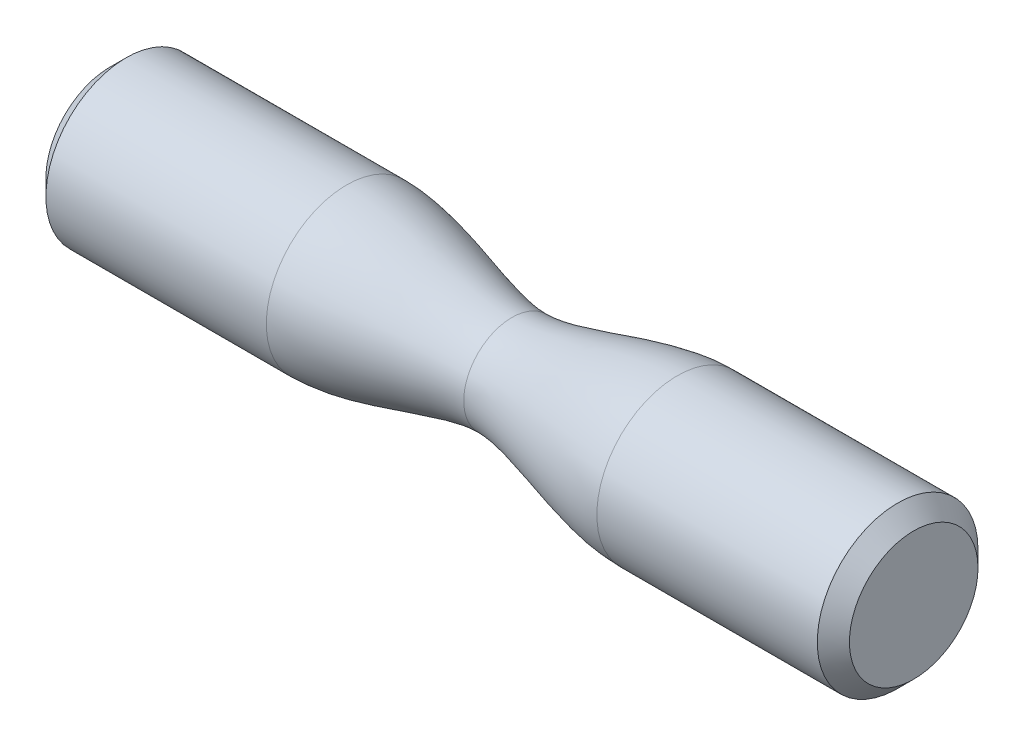
ISO-10303-21;
HEADER;
FILE_DESCRIPTION(('STEP AP214'),'2;1');
FILE_NAME('part.step','',(''),(''),'','','');
FILE_SCHEMA(('AUTOMOTIVE_DESIGN { 1 0 10303 214 1 1 1 1 }'));
ENDSEC;
DATA;
#1=APPLICATION_CONTEXT('core data for automotive mechanical design processes');
#2=APPLICATION_PROTOCOL_DEFINITION('international standard','automotive_design',2000,#1);
#3=PRODUCT_CONTEXT('',#1,'mechanical');
#4=PRODUCT('Part','Part','',(#3));
#5=PRODUCT_RELATED_PRODUCT_CATEGORY('part','',(#4));
#6=PRODUCT_DEFINITION_FORMATION('','',#4);
#7=PRODUCT_DEFINITION_CONTEXT('part definition',#1,'design');
#8=PRODUCT_DEFINITION('design','',#6,#7);
#9=PRODUCT_DEFINITION_SHAPE('','',#8);
#10=(LENGTH_UNIT() NAMED_UNIT(*) SI_UNIT(.MILLI.,.METRE.));
#11=(NAMED_UNIT(*) PLANE_ANGLE_UNIT() SI_UNIT($,.RADIAN.));
#12=(NAMED_UNIT(*) SI_UNIT($,.STERADIAN.) SOLID_ANGLE_UNIT());
#13=UNCERTAINTY_MEASURE_WITH_UNIT(LENGTH_MEASURE(1.E-05),#10,'distance_accuracy_value','');
#14=(GEOMETRIC_REPRESENTATION_CONTEXT(3) GLOBAL_UNCERTAINTY_ASSIGNED_CONTEXT((#13)) GLOBAL_UNIT_ASSIGNED_CONTEXT((#10,
#11,#12)) REPRESENTATION_CONTEXT('',''));
#15=CARTESIAN_POINT('',(0.,0.,0.));
#16=DIRECTION('',(0.,0.,1.));
#17=DIRECTION('',(1.,0.,0.));
#18=AXIS2_PLACEMENT_3D('',#15,#16,#17);
#19=CARTESIAN_POINT('',(-7.9375,0.,0.));
#20=DIRECTION('',(1.,0.,0.));
#21=DIRECTION('',(0.,0.,-1.));
#22=AXIS2_PLACEMENT_3D('',#19,#20,#21);
#23=CYLINDRICAL_SURFACE('',#22,1.5875);
#24=CARTESIAN_POINT('',(-3.26508905624972,0.,0.));
#25=DIRECTION('',(1.,0.,0.));
#26=DIRECTION('',(0.,0.,-1.));
#27=AXIS2_PLACEMENT_3D('',#24,#25,#26);
#28=CIRCLE('',#27,1.58750000000001);
#29=CARTESIAN_POINT('',(-3.26508905624972,0.,-1.58750000000001));
#30=VERTEX_POINT('',#29);
#31=EDGE_CURVE('E50',#30,#30,#28,.T.);
#32=ORIENTED_EDGE('',*,*,#31,.F.);
#33=EDGE_LOOP('',(#32));
#34=FACE_BOUND('',#33,.T.);
#35=CARTESIAN_POINT('',(-7.62,0.,0.));
#36=DIRECTION('',(1.,0.,0.));
#37=DIRECTION('',(0.,0.,-1.));
#38=AXIS2_PLACEMENT_3D('',#35,#36,#37);
#39=CIRCLE('',#38,1.5875);
#40=CARTESIAN_POINT('',(-7.62,0.,-1.5875));
#41=VERTEX_POINT('',#40);
#42=EDGE_CURVE('E41',#41,#41,#39,.T.);
#43=ORIENTED_EDGE('',*,*,#42,.T.);
#44=EDGE_LOOP('',(#43));
#45=FACE_BOUND('',#44,.T.);
#46=ADVANCED_FACE('F30',(#34,#45),#23,.T.);
#47=CARTESIAN_POINT('',(-7.9375,0.,0.));
#48=DIRECTION('',(1.,0.,0.));
#49=DIRECTION('',(0.,0.,-1.));
#50=AXIS2_PLACEMENT_3D('',#47,#48,#49);
#51=PLANE('',#50);
#52=CARTESIAN_POINT('',(-7.9375,0.,0.));
#53=DIRECTION('',(1.,0.,0.));
#54=DIRECTION('',(0.,0.,-1.));
#55=AXIS2_PLACEMENT_3D('',#52,#53,#54);
#56=CIRCLE('',#55,1.27);
#57=CARTESIAN_POINT('',(-7.9375,0.,-1.27));
#58=VERTEX_POINT('',#57);
#59=EDGE_CURVE('E10',#58,#58,#56,.F.);
#60=ORIENTED_EDGE('',*,*,#59,.T.);
#61=EDGE_LOOP('',(#60));
#62=FACE_BOUND('',#61,.T.);
#63=ADVANCED_FACE('F83',(#62),#51,.F.);
#64=CARTESIAN_POINT('',(-7.62,0.,0.));
#65=DIRECTION('',(1.,0.,0.));
#66=DIRECTION('',(0.,0.,-1.));
#67=AXIS2_PLACEMENT_3D('',#64,#65,#66);
#68=CONICAL_SURFACE('',#67,1.5875,0.78539816339745);
#69=ORIENTED_EDGE('',*,*,#59,.F.);
#70=EDGE_LOOP('',(#69));
#71=FACE_BOUND('',#70,.T.);
#72=ORIENTED_EDGE('',*,*,#42,.F.);
#73=EDGE_LOOP('',(#72));
#74=FACE_BOUND('',#73,.T.);
#75=ADVANCED_FACE('F32',(#71,#74),#68,.T.);
#76=CARTESIAN_POINT('',(-3.26508905624972,1.5875,0.));
#77=CARTESIAN_POINT('',(-2.11443309165534,1.5875,0.));
#78=CARTESIAN_POINT('',(-0.878501648734731,0.9525,0.));
#79=CARTESIAN_POINT('',(0.,0.952500000000001,0.));
#80=B_SPLINE_CURVE_WITH_KNOTS('',3,(#76,#77,#78,#79),.UNSPECIFIED.,.F.,.F.,(4,4),(0.,1.),.UNSPECIFIED.);
#81=CARTESIAN_POINT('',(7.9375,0.,0.));
#82=DIRECTION('',(1.,0.,0.));
#83=AXIS1_PLACEMENT('',#81,#82);
#84=SURFACE_OF_REVOLUTION('',#80,#83);
#85=CARTESIAN_POINT('',(0.,0.,0.));
#86=DIRECTION('',(1.,0.,0.));
#87=DIRECTION('',(0.,0.,-1.));
#88=AXIS2_PLACEMENT_3D('',#85,#86,#87);
#89=CIRCLE('',#88,0.952500000000001);
#90=CARTESIAN_POINT('',(0.,0.,-0.952500000000001));
#91=VERTEX_POINT('',#90);
#92=EDGE_CURVE('E53',#91,#91,#89,.T.);
#93=ORIENTED_EDGE('',*,*,#92,.F.);
#94=EDGE_LOOP('',(#93));
#95=FACE_BOUND('',#94,.T.);
#96=ORIENTED_EDGE('',*,*,#31,.T.);
#97=EDGE_LOOP('',(#96));
#98=FACE_BOUND('',#97,.T.);
#99=ADVANCED_FACE('F74',(#95,#98),#84,.T.);
#100=CARTESIAN_POINT('',(3.26508905624972,1.5875,0.));
#101=CARTESIAN_POINT('',(2.11443309165534,1.5875,0.));
#102=CARTESIAN_POINT('',(0.878501648734731,0.9525,0.));
#103=CARTESIAN_POINT('',(0.,0.952500000000001,0.));
#104=B_SPLINE_CURVE_WITH_KNOTS('',3,(#100,#101,#102,#103),.UNSPECIFIED.,.F.,.F.,(4,4),(0.,1.),.UNSPECIFIED.);
#105=CARTESIAN_POINT('',(7.9375,0.,0.));
#106=DIRECTION('',(1.,0.,0.));
#107=AXIS1_PLACEMENT('',#105,#106);
#108=SURFACE_OF_REVOLUTION('',#104,#107);
#109=ORIENTED_EDGE('',*,*,#92,.T.);
#110=EDGE_LOOP('',(#109));
#111=FACE_BOUND('',#110,.T.);
#112=CARTESIAN_POINT('',(3.26508905624972,0.,0.));
#113=DIRECTION('',(1.,0.,0.));
#114=DIRECTION('',(0.,0.,-1.));
#115=AXIS2_PLACEMENT_3D('',#112,#113,#114);
#116=CIRCLE('',#115,1.5875);
#117=CARTESIAN_POINT('',(3.26508905624972,0.,-1.5875));
#118=VERTEX_POINT('',#117);
#119=EDGE_CURVE('E56',#118,#118,#116,.T.);
#120=ORIENTED_EDGE('',*,*,#119,.F.);
#121=EDGE_LOOP('',(#120));
#122=FACE_BOUND('',#121,.T.);
#123=ADVANCED_FACE('F70',(#111,#122),#108,.F.);
#124=CARTESIAN_POINT('',(7.9375,0.,0.));
#125=DIRECTION('',(1.,0.,0.));
#126=DIRECTION('',(0.,0.,-1.));
#127=AXIS2_PLACEMENT_3D('',#124,#125,#126);
#128=PLANE('',#127);
#129=CARTESIAN_POINT('',(7.9375,0.,0.));
#130=DIRECTION('',(1.,0.,0.));
#131=DIRECTION('',(0.,0.,-1.));
#132=AXIS2_PLACEMENT_3D('',#129,#130,#131);
#133=CIRCLE('',#132,1.27);
#134=CARTESIAN_POINT('',(7.9375,0.,-1.27));
#135=VERTEX_POINT('',#134);
#136=EDGE_CURVE('E45',#135,#135,#133,.T.);
#137=ORIENTED_EDGE('',*,*,#136,.T.);
#138=EDGE_LOOP('',(#137));
#139=FACE_BOUND('',#138,.T.);
#140=ADVANCED_FACE('F73',(#139),#128,.T.);
#141=CARTESIAN_POINT('',(7.9375,0.,0.));
#142=DIRECTION('',(-1.,0.,0.));
#143=DIRECTION('',(0.,0.,1.));
#144=AXIS2_PLACEMENT_3D('',#141,#142,#143);
#145=CONICAL_SURFACE('',#144,1.27,0.785398163397445);
#146=CARTESIAN_POINT('',(7.62,0.,0.));
#147=DIRECTION('',(1.,0.,0.));
#148=DIRECTION('',(0.,0.,-1.));
#149=AXIS2_PLACEMENT_3D('',#146,#147,#148);
#150=CIRCLE('',#149,1.5875);
#151=CARTESIAN_POINT('',(7.62,0.,-1.5875));
#152=VERTEX_POINT('',#151);
#153=EDGE_CURVE('E37',#152,#152,#150,.F.);
#154=ORIENTED_EDGE('',*,*,#153,.F.);
#155=EDGE_LOOP('',(#154));
#156=FACE_BOUND('',#155,.T.);
#157=ORIENTED_EDGE('',*,*,#136,.F.);
#158=EDGE_LOOP('',(#157));
#159=FACE_BOUND('',#158,.T.);
#160=ADVANCED_FACE('F81',(#156,#159),#145,.T.);
#161=ORIENTED_EDGE('',*,*,#153,.T.);
#162=EDGE_LOOP('',(#161));
#163=FACE_BOUND('',#162,.T.);
#164=ORIENTED_EDGE('',*,*,#119,.T.);
#165=EDGE_LOOP('',(#164));
#166=FACE_BOUND('',#165,.T.);
#167=ADVANCED_FACE('F88',(#163,#166),#23,.T.);
#168=CLOSED_SHELL('',(#46,#63,#75,#99,#123,#140,#160,#167));
#169=MANIFOLD_SOLID_BREP('B2',#168);
#170=ADVANCED_BREP_SHAPE_REPRESENTATION('',(#18,#169),#14);
#171=SHAPE_DEFINITION_REPRESENTATION(#9,#170);
ENDSEC;
END-ISO-10303-21;
